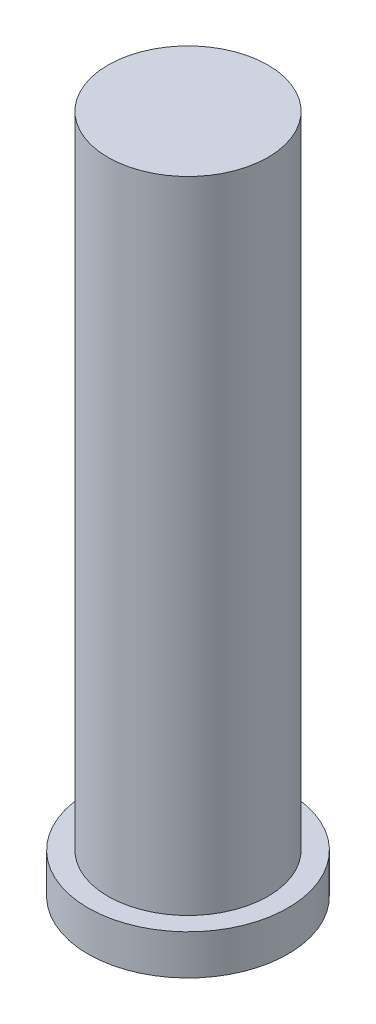
ISO-10303-21;
HEADER;
FILE_DESCRIPTION(('STEP AP214'),'2;1');
FILE_NAME('part.step','',(''),(''),'','','');
FILE_SCHEMA(('AUTOMOTIVE_DESIGN { 1 0 10303 214 1 1 1 1 }'));
ENDSEC;
DATA;
#1=APPLICATION_CONTEXT('core data for automotive mechanical design processes');
#2=APPLICATION_PROTOCOL_DEFINITION('international standard','automotive_design',2000,#1);
#3=PRODUCT_CONTEXT('',#1,'mechanical');
#4=PRODUCT('Part','Part','',(#3));
#5=PRODUCT_RELATED_PRODUCT_CATEGORY('part','',(#4));
#6=PRODUCT_DEFINITION_FORMATION('','',#4);
#7=PRODUCT_DEFINITION_CONTEXT('part definition',#1,'design');
#8=PRODUCT_DEFINITION('design','',#6,#7);
#9=PRODUCT_DEFINITION_SHAPE('','',#8);
#10=(LENGTH_UNIT() NAMED_UNIT(*) SI_UNIT(.MILLI.,.METRE.));
#11=(NAMED_UNIT(*) PLANE_ANGLE_UNIT() SI_UNIT($,.RADIAN.));
#12=(NAMED_UNIT(*) SI_UNIT($,.STERADIAN.) SOLID_ANGLE_UNIT());
#13=UNCERTAINTY_MEASURE_WITH_UNIT(LENGTH_MEASURE(1.E-05),#10,'distance_accuracy_value','');
#14=(GEOMETRIC_REPRESENTATION_CONTEXT(3) GLOBAL_UNCERTAINTY_ASSIGNED_CONTEXT((#13)) GLOBAL_UNIT_ASSIGNED_CONTEXT((#10,
#11,#12)) REPRESENTATION_CONTEXT('',''));
#15=CARTESIAN_POINT('',(0.,0.,0.));
#16=DIRECTION('',(0.,0.,1.));
#17=DIRECTION('',(1.,0.,0.));
#18=AXIS2_PLACEMENT_3D('',#15,#16,#17);
#19=CARTESIAN_POINT('',(0.,8.,0.));
#20=DIRECTION('',(0.,-1.,0.));
#21=DIRECTION('',(0.,0.,-1.));
#22=AXIS2_PLACEMENT_3D('',#19,#20,#21);
#23=CYLINDRICAL_SURFACE('',#22,1.);
#24=CARTESIAN_POINT('',(0.,8.,0.));
#25=DIRECTION('',(0.,1.,0.));
#26=DIRECTION('',(0.,0.,1.));
#27=AXIS2_PLACEMENT_3D('',#24,#25,#26);
#28=CIRCLE('',#27,1.);
#29=CARTESIAN_POINT('',(0.,8.,1.));
#30=VERTEX_POINT('',#29);
#31=EDGE_CURVE('E10',#30,#30,#28,.T.);
#32=ORIENTED_EDGE('',*,*,#31,.F.);
#33=EDGE_LOOP('',(#32));
#34=FACE_BOUND('',#33,.T.);
#35=CARTESIAN_POINT('',(0.,0.,0.));
#36=DIRECTION('',(0.,1.,0.));
#37=DIRECTION('',(0.,0.,1.));
#38=AXIS2_PLACEMENT_3D('',#35,#36,#37);
#39=CIRCLE('',#38,1.);
#40=CARTESIAN_POINT('',(0.,0.,1.));
#41=VERTEX_POINT('',#40);
#42=EDGE_CURVE('E40',#41,#41,#39,.T.);
#43=ORIENTED_EDGE('',*,*,#42,.T.);
#44=EDGE_LOOP('',(#43));
#45=FACE_BOUND('',#44,.T.);
#46=ADVANCED_FACE('F37',(#34,#45),#23,.T.);
#47=CARTESIAN_POINT('',(0.,8.,0.));
#48=DIRECTION('',(0.,1.,0.));
#49=DIRECTION('',(0.,0.,1.));
#50=AXIS2_PLACEMENT_3D('',#47,#48,#49);
#51=PLANE('',#50);
#52=ORIENTED_EDGE('',*,*,#31,.T.);
#53=EDGE_LOOP('',(#52));
#54=FACE_BOUND('',#53,.T.);
#55=ADVANCED_FACE('F68',(#54),#51,.T.);
#56=CARTESIAN_POINT('',(0.,-0.5,0.));
#57=DIRECTION('',(0.,1.,0.));
#58=DIRECTION('',(0.,0.,1.));
#59=AXIS2_PLACEMENT_3D('',#56,#57,#58);
#60=CYLINDRICAL_SURFACE('',#59,1.25);
#61=CARTESIAN_POINT('',(0.,-0.5,0.));
#62=DIRECTION('',(0.,1.,0.));
#63=DIRECTION('',(0.,0.,1.));
#64=AXIS2_PLACEMENT_3D('',#61,#62,#63);
#65=CIRCLE('',#64,1.25);
#66=CARTESIAN_POINT('',(0.,-0.5,1.25));
#67=VERTEX_POINT('',#66);
#68=EDGE_CURVE('E47',#67,#67,#65,.T.);
#69=ORIENTED_EDGE('',*,*,#68,.T.);
#70=EDGE_LOOP('',(#69));
#71=FACE_BOUND('',#70,.T.);
#72=CARTESIAN_POINT('',(0.,0.,0.));
#73=DIRECTION('',(0.,1.,0.));
#74=DIRECTION('',(0.,0.,1.));
#75=AXIS2_PLACEMENT_3D('',#72,#73,#74);
#76=CIRCLE('',#75,1.25);
#77=CARTESIAN_POINT('',(0.,0.,1.25));
#78=VERTEX_POINT('',#77);
#79=EDGE_CURVE('E49',#78,#78,#76,.T.);
#80=ORIENTED_EDGE('',*,*,#79,.F.);
#81=EDGE_LOOP('',(#80));
#82=FACE_BOUND('',#81,.T.);
#83=ADVANCED_FACE('F55',(#71,#82),#60,.T.);
#84=CARTESIAN_POINT('',(0.,-0.5,0.));
#85=DIRECTION('',(0.,1.,0.));
#86=DIRECTION('',(0.,0.,1.));
#87=AXIS2_PLACEMENT_3D('',#84,#85,#86);
#88=PLANE('',#87);
#89=ORIENTED_EDGE('',*,*,#68,.F.);
#90=EDGE_LOOP('',(#89));
#91=FACE_BOUND('',#90,.T.);
#92=ADVANCED_FACE('F58',(#91),#88,.F.);
#93=CARTESIAN_POINT('',(0.,0.,0.));
#94=DIRECTION('',(0.,1.,0.));
#95=DIRECTION('',(0.,0.,1.));
#96=AXIS2_PLACEMENT_3D('',#93,#94,#95);
#97=PLANE('',#96);
#98=ORIENTED_EDGE('',*,*,#42,.F.);
#99=EDGE_LOOP('',(#98));
#100=FACE_BOUND('',#99,.T.);
#101=ORIENTED_EDGE('',*,*,#79,.T.);
#102=EDGE_LOOP('',(#101));
#103=FACE_BOUND('',#102,.T.);
#104=ADVANCED_FACE('F60',(#100,#103),#97,.T.);
#105=CLOSED_SHELL('',(#46,#55,#83,#92,#104));
#106=MANIFOLD_SOLID_BREP('B2',#105);
#107=ADVANCED_BREP_SHAPE_REPRESENTATION('',(#18,#106),#14);
#108=SHAPE_DEFINITION_REPRESENTATION(#9,#107);
ENDSEC;
END-ISO-10303-21;
